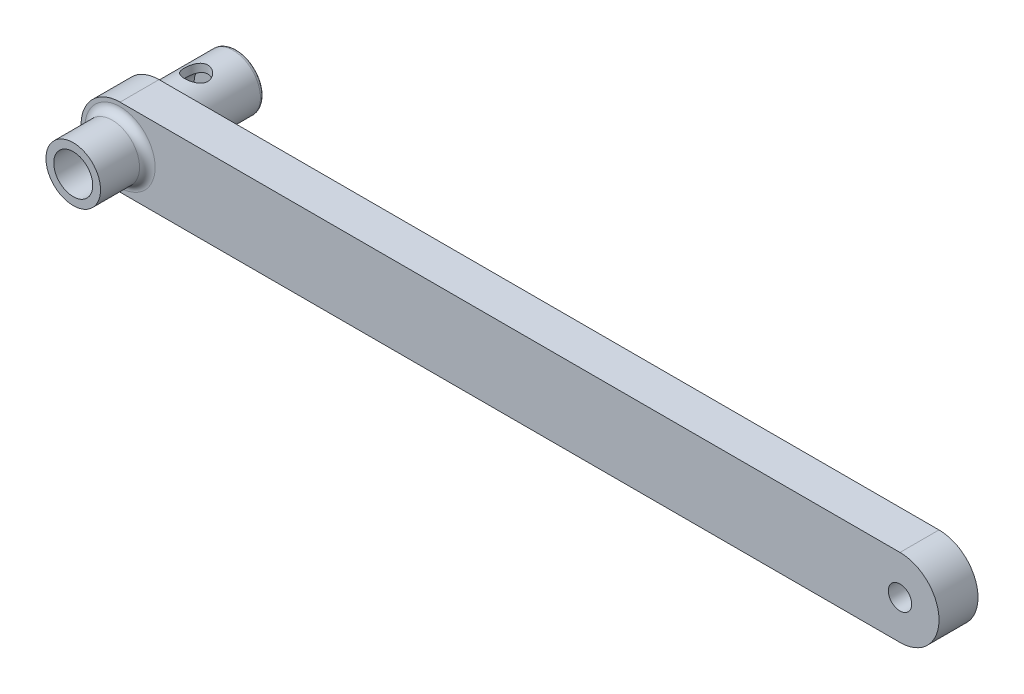
ISO-10303-21;
HEADER;
FILE_DESCRIPTION(('STEP AP214'),'2;1');
FILE_NAME('part.step','',(''),(''),'','','');
FILE_SCHEMA(('AUTOMOTIVE_DESIGN { 1 0 10303 214 1 1 1 1 }'));
ENDSEC;
DATA;
#1=APPLICATION_CONTEXT('core data for automotive mechanical design processes');
#2=APPLICATION_PROTOCOL_DEFINITION('international standard','automotive_design',2000,#1);
#3=PRODUCT_CONTEXT('',#1,'mechanical');
#4=PRODUCT('Part','Part','',(#3));
#5=PRODUCT_RELATED_PRODUCT_CATEGORY('part','',(#4));
#6=PRODUCT_DEFINITION_FORMATION('','',#4);
#7=PRODUCT_DEFINITION_CONTEXT('part definition',#1,'design');
#8=PRODUCT_DEFINITION('design','',#6,#7);
#9=PRODUCT_DEFINITION_SHAPE('','',#8);
#10=(LENGTH_UNIT() NAMED_UNIT(*) SI_UNIT(.MILLI.,.METRE.));
#11=(NAMED_UNIT(*) PLANE_ANGLE_UNIT() SI_UNIT($,.RADIAN.));
#12=(NAMED_UNIT(*) SI_UNIT($,.STERADIAN.) SOLID_ANGLE_UNIT());
#13=UNCERTAINTY_MEASURE_WITH_UNIT(LENGTH_MEASURE(1.E-05),#10,'distance_accuracy_value','');
#14=(GEOMETRIC_REPRESENTATION_CONTEXT(3) GLOBAL_UNCERTAINTY_ASSIGNED_CONTEXT((#13)) GLOBAL_UNIT_ASSIGNED_CONTEXT((#10,
#11,#12)) REPRESENTATION_CONTEXT('',''));
#15=CARTESIAN_POINT('',(0.,0.,0.));
#16=DIRECTION('',(0.,0.,1.));
#17=DIRECTION('',(1.,0.,0.));
#18=AXIS2_PLACEMENT_3D('',#15,#16,#17);
#19=CARTESIAN_POINT('',(-50.,0.,-0.999999999999999));
#20=DIRECTION('',(0.,0.,1.));
#21=DIRECTION('',(1.,0.,0.));
#22=AXIS2_PLACEMENT_3D('',#19,#20,#21);
#23=TOROIDAL_SURFACE('',#22,4.5,1.);
#24=CARTESIAN_POINT('',(-50.,0.,0.));
#25=DIRECTION('',(0.,0.,1.));
#26=DIRECTION('',(1.,0.,0.));
#27=AXIS2_PLACEMENT_3D('',#24,#25,#26);
#28=CIRCLE('',#27,4.5);
#29=CARTESIAN_POINT('',(-45.5,0.,0.));
#30=VERTEX_POINT('',#29);
#31=EDGE_CURVE('E41',#30,#30,#28,.T.);
#32=ORIENTED_EDGE('',*,*,#31,.F.);
#33=EDGE_LOOP('',(#32));
#34=FACE_BOUND('',#33,.T.);
#35=CARTESIAN_POINT('',(-50.,0.,-0.999999999999999));
#36=DIRECTION('',(0.,0.,1.));
#37=DIRECTION('',(1.,0.,0.));
#38=AXIS2_PLACEMENT_3D('',#35,#36,#37);
#39=CIRCLE('',#38,3.5);
#40=CARTESIAN_POINT('',(-46.5,0.,-0.999999999999999));
#41=VERTEX_POINT('',#40);
#42=EDGE_CURVE('E11',#41,#41,#39,.F.);
#43=ORIENTED_EDGE('',*,*,#42,.F.);
#44=EDGE_LOOP('',(#43));
#45=FACE_BOUND('',#44,.T.);
#46=ADVANCED_FACE('F33',(#34,#45),#23,.F.);
#47=CARTESIAN_POINT('',(-50.,0.,6.));
#48=DIRECTION('',(0.,0.,1.));
#49=DIRECTION('',(1.,0.,0.));
#50=AXIS2_PLACEMENT_3D('',#47,#48,#49);
#51=TOROIDAL_SURFACE('',#50,4.5,1.);
#52=CARTESIAN_POINT('',(-50.,0.,6.));
#53=DIRECTION('',(0.,0.,1.));
#54=DIRECTION('',(1.,0.,0.));
#55=AXIS2_PLACEMENT_3D('',#52,#53,#54);
#56=CIRCLE('',#55,3.5);
#57=CARTESIAN_POINT('',(-46.5,0.,6.));
#58=VERTEX_POINT('',#57);
#59=EDGE_CURVE('E116',#58,#58,#56,.T.);
#60=ORIENTED_EDGE('',*,*,#59,.F.);
#61=EDGE_LOOP('',(#60));
#62=FACE_BOUND('',#61,.T.);
#63=CARTESIAN_POINT('',(-50.,0.,5.));
#64=DIRECTION('',(0.,0.,1.));
#65=DIRECTION('',(1.,0.,0.));
#66=AXIS2_PLACEMENT_3D('',#63,#64,#65);
#67=CIRCLE('',#66,4.5);
#68=CARTESIAN_POINT('',(-45.5,0.,5.));
#69=VERTEX_POINT('',#68);
#70=EDGE_CURVE('E203',#69,#69,#67,.F.);
#71=ORIENTED_EDGE('',*,*,#70,.F.);
#72=EDGE_LOOP('',(#71));
#73=FACE_BOUND('',#72,.T.);
#74=ADVANCED_FACE('F174',(#62,#73),#51,.F.);
#75=CARTESIAN_POINT('',(-50.,0.,5.));
#76=DIRECTION('',(0.,0.,1.));
#77=DIRECTION('',(1.,0.,0.));
#78=AXIS2_PLACEMENT_3D('',#75,#76,#77);
#79=PLANE('',#78);
#80=ORIENTED_EDGE('',*,*,#70,.T.);
#81=EDGE_LOOP('',(#80));
#82=FACE_BOUND('',#81,.T.);
#83=CARTESIAN_POINT('',(50.,0.,5.));
#84=DIRECTION('',(0.,0.,1.));
#85=DIRECTION('',(1.,0.,0.));
#86=AXIS2_PLACEMENT_3D('',#83,#84,#85);
#87=CIRCLE('',#86,1.5);
#88=CARTESIAN_POINT('',(51.5,0.,5.));
#89=VERTEX_POINT('',#88);
#90=EDGE_CURVE('E103',#89,#89,#87,.T.);
#91=ORIENTED_EDGE('',*,*,#90,.F.);
#92=EDGE_LOOP('',(#91));
#93=FACE_BOUND('',#92,.T.);
#94=CARTESIAN_POINT('',(-50.,0.,5.));
#95=DIRECTION('',(0.,0.,1.));
#96=DIRECTION('',(1.,0.,0.));
#97=AXIS2_PLACEMENT_3D('',#94,#95,#96);
#98=CIRCLE('',#97,5.);
#99=CARTESIAN_POINT('',(-50.,5.,5.));
#100=VERTEX_POINT('',#99);
#101=CARTESIAN_POINT('',(-50.,-5.,5.));
#102=VERTEX_POINT('',#101);
#103=EDGE_CURVE('E85',#100,#102,#98,.T.);
#104=ORIENTED_EDGE('',*,*,#103,.T.);
#105=DIRECTION('',(1.,0.,0.));
#106=VECTOR('',#105,1.);
#107=CARTESIAN_POINT('',(-50.,-5.,5.));
#108=LINE('',#107,#106);
#109=CARTESIAN_POINT('',(50.,-4.99999999999998,5.));
#110=VERTEX_POINT('',#109);
#111=EDGE_CURVE('E80',#102,#110,#108,.T.);
#112=ORIENTED_EDGE('',*,*,#111,.T.);
#113=CARTESIAN_POINT('',(50.,0.,5.));
#114=DIRECTION('',(0.,0.,1.));
#115=DIRECTION('',(1.,0.,0.));
#116=AXIS2_PLACEMENT_3D('',#113,#114,#115);
#117=CIRCLE('',#116,5.);
#118=CARTESIAN_POINT('',(50.,5.00000000000002,5.));
#119=VERTEX_POINT('',#118);
#120=EDGE_CURVE('E83',#110,#119,#117,.T.);
#121=ORIENTED_EDGE('',*,*,#120,.T.);
#122=DIRECTION('',(-1.,0.,0.));
#123=VECTOR('',#122,1.);
#124=CARTESIAN_POINT('',(-50.,5.,5.));
#125=LINE('',#124,#123);
#126=EDGE_CURVE('E49',#119,#100,#125,.T.);
#127=ORIENTED_EDGE('',*,*,#126,.T.);
#128=EDGE_LOOP('',(#104,#112,#121,#127));
#129=FACE_BOUND('',#128,.T.);
#130=ADVANCED_FACE('F81',(#82,#93,#129),#79,.T.);
#131=CARTESIAN_POINT('',(-50.,0.,5.));
#132=DIRECTION('',(0.,0.,-1.));
#133=DIRECTION('',(-1.,0.,0.));
#134=AXIS2_PLACEMENT_3D('',#131,#132,#133);
#135=CYLINDRICAL_SURFACE('',#134,2.5);
#136=CARTESIAN_POINT('',(-50.,-2.5,-3.25));
#137=CARTESIAN_POINT('',(-49.923270166538,-2.49999625789733,-3.25000409100988));
#138=CARTESIAN_POINT('',(-49.8464176793558,-2.4964290461501,-3.25592867092626));
#139=CARTESIAN_POINT('',(-49.6950244904693,-2.48249903608568,-3.27932431951532));
#140=CARTESIAN_POINT('',(-49.620489965404,-2.47211948032719,-3.29682386185422));
#141=CARTESIAN_POINT('',(-49.4762481722092,-2.44561558054488,-3.34238636116685));
#142=CARTESIAN_POINT('',(-49.4065189717734,-2.42951973272944,-3.37039695816315));
#143=CARTESIAN_POINT('',(-49.2729696817853,-2.39295367626408,-3.43586033314102));
#144=CARTESIAN_POINT('',(-49.2091481305836,-2.37248455380255,-3.47331076696874));
#145=CARTESIAN_POINT('',(-49.0837007210007,-2.32705360719088,-3.55977482670858));
#146=CARTESIAN_POINT('',(-49.0226159799186,-2.30186792195985,-3.60945369535139));
#147=CARTESIAN_POINT('',(-48.9091172958811,-2.25030439279634,-3.71746720382827));
#148=CARTESIAN_POINT('',(-48.8567146505189,-2.22392505153571,-3.77581293718731));
#149=CARTESIAN_POINT('',(-48.7555500323703,-2.1691106699591,-3.90792351049673));
#150=CARTESIAN_POINT('',(-48.7080223362119,-2.14082017703649,-3.98270177098128));
#151=CARTESIAN_POINT('',(-48.626385622351,-2.08938301412124,-4.14084657324311));
#152=CARTESIAN_POINT('',(-48.5922548266484,-2.06622802273938,-4.22419889624757));
#153=CARTESIAN_POINT('',(-48.5455939828578,-2.0335462966093,-4.37659645065324));
#154=CARTESIAN_POINT('',(-48.5298380275317,-2.02207883137591,-4.44423599861032));
#155=CARTESIAN_POINT('',(-48.5078382765952,-2.00590308295503,-4.58180371583037));
#156=CARTESIAN_POINT('',(-48.5015826544316,-2.00118639643759,-4.6517289287545));
#157=CARTESIAN_POINT('',(-48.4989449120399,-1.99920922463856,-4.79201149421734));
#158=CARTESIAN_POINT('',(-48.5025821659158,-2.00196337012718,-4.8623694250932));
#159=CARTESIAN_POINT('',(-48.5195393952117,-2.01453261443741,-5.00127877542759));
#160=CARTESIAN_POINT('',(-48.532866653799,-2.02435302432226,-5.06982879584745));
#161=CARTESIAN_POINT('',(-48.5682607811821,-2.04953186944258,-5.20253024212811));
#162=CARTESIAN_POINT('',(-48.5902125133391,-2.06481711652537,-5.26672705392449));
#163=CARTESIAN_POINT('',(-48.6420493822916,-2.09927051350828,-5.39069499092813));
#164=CARTESIAN_POINT('',(-48.671937427403,-2.11844008623465,-5.45046448342393));
#165=CARTESIAN_POINT('',(-48.7448201681542,-2.16255327268985,-5.57498409712281));
#166=CARTESIAN_POINT('',(-48.7891927560228,-2.18792043372992,-5.63877809295493));
#167=CARTESIAN_POINT('',(-48.88708907216,-2.23930599764381,-5.75867648366702));
#168=CARTESIAN_POINT('',(-48.9406215489942,-2.26532500262149,-5.81477343397651));
#169=CARTESIAN_POINT('',(-49.064188165617,-2.31935504958317,-5.92561298182176));
#170=CARTESIAN_POINT('',(-49.135482317295,-2.34713836268533,-5.97907730601599));
#171=CARTESIAN_POINT('',(-49.287723949541,-2.39772428433981,-6.07312204719791));
#172=CARTESIAN_POINT('',(-49.3686662360564,-2.42052955425515,-6.11370935378996));
#173=CARTESIAN_POINT('',(-49.5328024147318,-2.45730392066151,-6.1779321827959));
#174=CARTESIAN_POINT('',(-49.6155323758264,-2.47173957439704,-6.20247535571592));
#175=CARTESIAN_POINT('',(-49.7849521048554,-2.49218842813551,-6.23701119740538));
#176=CARTESIAN_POINT('',(-49.8716369943387,-2.49821172952738,-6.24702131775358));
#177=CARTESIAN_POINT('',(-50.0337146143774,-2.5009057037461,-6.25150784767831));
#178=CARTESIAN_POINT('',(-50.1090424734187,-2.49873521714286,-6.24790885508518));
#179=CARTESIAN_POINT('',(-50.2578294019861,-2.48778712087049,-6.22957414692808));
#180=CARTESIAN_POINT('',(-50.3312885093761,-2.47900964518038,-6.21483865719419));
#181=CARTESIAN_POINT('',(-50.4725749321576,-2.45594792442191,-6.17545656718754));
#182=CARTESIAN_POINT('',(-50.5404957509285,-2.44180275662555,-6.15105965092654));
#183=CARTESIAN_POINT('',(-50.6712657490873,-2.40913880862845,-6.09332262363473));
#184=CARTESIAN_POINT('',(-50.7341139249639,-2.39061916586511,-6.05998074865333));
#185=CARTESIAN_POINT('',(-50.8600062628239,-2.3484549623736,-5.98144302079129));
#186=CARTESIAN_POINT('',(-50.9223941504569,-2.3244780273988,-5.93537617092161));
#187=CARTESIAN_POINT('',(-51.0390260313102,-2.27474265574732,-5.83460860651138));
#188=CARTESIAN_POINT('',(-51.0932604027374,-2.2489821658636,-5.77989784514746));
#189=CARTESIAN_POINT('',(-51.1993199673558,-2.19445423909891,-5.65508960996285));
#190=CARTESIAN_POINT('',(-51.2499101963092,-2.16573241746291,-5.5839161145345));
#191=CARTESIAN_POINT('',(-51.3384523891567,-2.1121618206671,-5.43278397543179));
#192=CARTESIAN_POINT('',(-51.3764176676978,-2.08730897997689,-5.35283470610721));
#193=CARTESIAN_POINT('',(-51.4314257879578,-2.04984909240519,-5.2037569776933));
#194=CARTESIAN_POINT('',(-51.4512162533619,-2.03575659328728,-5.13601968764141));
#195=CARTESIAN_POINT('',(-51.4811366390597,-2.01409605743544,-4.99746792191989));
#196=CARTESIAN_POINT('',(-51.4912799529763,-2.00651897642721,-4.92665785567216));
#197=CARTESIAN_POINT('',(-51.5013413041663,-1.99900446616268,-4.78362305240296));
#198=CARTESIAN_POINT('',(-51.5012208910787,-1.99909576445937,-4.71139400931295));
#199=CARTESIAN_POINT('',(-51.4906647295933,-2.0069771789285,-4.56810556439053));
#200=CARTESIAN_POINT('',(-51.4802233721576,-2.0147714813882,-4.4970468199194));
#201=CARTESIAN_POINT('',(-51.4504017414891,-2.0363318524298,-4.36151158242781));
#202=CARTESIAN_POINT('',(-51.4314763684535,-2.04979211805581,-4.29688290569312));
#203=CARTESIAN_POINT('',(-51.3856324207699,-2.08105501960152,-4.17166274552577));
#204=CARTESIAN_POINT('',(-51.3587108358848,-2.09885929040482,-4.11107279303944));
#205=CARTESIAN_POINT('',(-51.2928924555573,-2.14012990550917,-3.98568014277921));
#206=CARTESIAN_POINT('',(-51.2527916767575,-2.1640458758264,-3.92165889614569));
#207=CARTESIAN_POINT('',(-51.1637569838908,-2.21320127030768,-3.8006199273827));
#208=CARTESIAN_POINT('',(-51.114815796078,-2.23844177205022,-3.74360803784744));
#209=CARTESIAN_POINT('',(-51.0000977742573,-2.29225690291477,-3.62864905086832));
#210=CARTESIAN_POINT('',(-50.9328768193139,-2.32070308663658,-3.5720689251038));
#211=CARTESIAN_POINT('',(-50.7884624344456,-2.37365428872368,-3.47090214413669));
#212=CARTESIAN_POINT('',(-50.7112654445015,-2.39815789310936,-3.4263197880152));
#213=CARTESIAN_POINT('',(-50.5511252308014,-2.43985578654394,-3.35221419242626));
#214=CARTESIAN_POINT('',(-50.4684300869572,-2.45725077479787,-3.32227193507317));
#215=CARTESIAN_POINT('',(-50.2979733061188,-2.48366273001246,-3.27727530478902));
#216=CARTESIAN_POINT('',(-50.2102320996486,-2.49271125871485,-3.26216483214301));
#217=CARTESIAN_POINT('',(-50.1015580969175,-2.49802001168187,-3.25330254529134));
#218=CARTESIAN_POINT('',(-50.0812762590283,-2.49876114656362,-3.2520655826939));
#219=CARTESIAN_POINT('',(-50.0406658206871,-2.49975164517367,-3.25041375362913));
#220=CARTESIAN_POINT('',(-50.0203372186376,-2.50000099184316,-3.24999891567909));
#221=CARTESIAN_POINT('',(-50.,-2.5,-3.25));
#222=B_SPLINE_CURVE_WITH_KNOTS('',3,(#136,#137,#138,#139,#140,#141,#142,#143,#144,#145,#146,
#147,#148,#149,#150,#151,#152,#153,#154,#155,#156,#157,#158,#159,#160,#161,#162,#163,#164,#165,
#166,#167,#168,#169,#170,#171,#172,#173,#174,#175,#176,#177,#178,#179,#180,#181,#182,#183,#184,
#185,#186,#187,#188,#189,#190,#191,#192,#193,#194,#195,#196,#197,#198,#199,#200,#201,#202,#203,
#204,#205,#206,#207,#208,#209,#210,#211,#212,#213,#214,#215,#216,#217,#218,#219,#220,#221),
.UNSPECIFIED.,.T.,.F.,(4,2,2,2,2,2,2,2,2,2,2,2,2,2,2,2,2,2,2,2,2,2,2,2,2,2,2,2,2,2,2,2,2,2,2,2,
2,2,2,2,2,2,4),(0.,0.230102237548654,0.460772627520013,0.690308884600009,0.919788197992274,
1.16681590732472,1.414162579348,1.69183813189807,1.96906040692092,2.17933829855634,
2.38935420916579,2.59978170870727,2.81036753273873,3.01823267593208,3.22617409809869,
3.47046995225164,3.71500044803675,3.99360957884692,4.27206939275325,4.53296790696561,
4.79355286918237,5.01875602722427,5.24395461863457,5.46367785689773,5.68344445659027,
5.92601365818364,6.16886690081838,6.44336762428012,6.71757792616458,6.93257787314695,
7.14727888733321,7.36278425777436,7.57840681155727,7.78364098331145,7.98895251523038,
8.22578610052289,8.46281544370211,8.73854311775522,9.01436946031988,9.28175654462679,
9.54812832184451,9.60911473335179,9.67010326027643),.UNSPECIFIED.);
#223=CARTESIAN_POINT('',(-50.,-2.5,-3.25));
#224=VERTEX_POINT('',#223);
#225=EDGE_CURVE('E158',#224,#224,#222,.T.);
#226=ORIENTED_EDGE('',*,*,#225,.F.);
#227=EDGE_LOOP('',(#226));
#228=FACE_BOUND('',#227,.T.);
#229=CARTESIAN_POINT('',(-50.,2.5,-3.25));
#230=CARTESIAN_POINT('',(-50.076729833462,2.49999625789733,-3.25000409100988));
#231=CARTESIAN_POINT('',(-50.1535823206442,2.4964290461501,-3.25592867092626));
#232=CARTESIAN_POINT('',(-50.3049755095307,2.48249903608568,-3.27932431951532));
#233=CARTESIAN_POINT('',(-50.3795100345961,2.47211948032719,-3.29682386185422));
#234=CARTESIAN_POINT('',(-50.5237518277908,2.44561558054488,-3.34238636116685));
#235=CARTESIAN_POINT('',(-50.5934810282266,2.42951973272944,-3.37039695816315));
#236=CARTESIAN_POINT('',(-50.7270303182147,2.39295367626408,-3.43586033314102));
#237=CARTESIAN_POINT('',(-50.7908518694164,2.37248455380255,-3.47331076696874));
#238=CARTESIAN_POINT('',(-50.9162992789993,2.32705360719088,-3.55977482670858));
#239=CARTESIAN_POINT('',(-50.9773840200814,2.30186792195985,-3.60945369535139));
#240=CARTESIAN_POINT('',(-51.0908827041189,2.25030439279634,-3.71746720382827));
#241=CARTESIAN_POINT('',(-51.1432853494811,2.22392505153571,-3.77581293718731));
#242=CARTESIAN_POINT('',(-51.2444499676297,2.1691106699591,-3.90792351049673));
#243=CARTESIAN_POINT('',(-51.2919776637881,2.14082017703649,-3.98270177098128));
#244=CARTESIAN_POINT('',(-51.373614377649,2.08938301412124,-4.14084657324311));
#245=CARTESIAN_POINT('',(-51.4077451733516,2.06622802273938,-4.22419889624757));
#246=CARTESIAN_POINT('',(-51.4544060171422,2.0335462966093,-4.37659645065324));
#247=CARTESIAN_POINT('',(-51.4701619724683,2.02207883137591,-4.44423599861032));
#248=CARTESIAN_POINT('',(-51.4921617234048,2.00590308295503,-4.58180371583037));
#249=CARTESIAN_POINT('',(-51.4984173455684,2.00118639643759,-4.6517289287545));
#250=CARTESIAN_POINT('',(-51.5010550879601,1.99920922463856,-4.79201149421734));
#251=CARTESIAN_POINT('',(-51.4974178340842,2.00196337012718,-4.8623694250932));
#252=CARTESIAN_POINT('',(-51.4804606047883,2.01453261443741,-5.00127877542759));
#253=CARTESIAN_POINT('',(-51.467133346201,2.02435302432226,-5.06982879584745));
#254=CARTESIAN_POINT('',(-51.4317392188179,2.04953186944258,-5.20253024212811));
#255=CARTESIAN_POINT('',(-51.4097874866609,2.06481711652537,-5.26672705392449));
#256=CARTESIAN_POINT('',(-51.3579506177084,2.09927051350828,-5.39069499092813));
#257=CARTESIAN_POINT('',(-51.3280625725971,2.11844008623465,-5.45046448342393));
#258=CARTESIAN_POINT('',(-51.2551798318458,2.16255327268985,-5.57498409712281));
#259=CARTESIAN_POINT('',(-51.2108072439772,2.18792043372992,-5.63877809295493));
#260=CARTESIAN_POINT('',(-51.11291092784,2.23930599764381,-5.75867648366702));
#261=CARTESIAN_POINT('',(-51.0593784510058,2.26532500262149,-5.81477343397651));
#262=CARTESIAN_POINT('',(-50.935811834383,2.31935504958317,-5.92561298182176));
#263=CARTESIAN_POINT('',(-50.864517682705,2.34713836268533,-5.979077306016));
#264=CARTESIAN_POINT('',(-50.712276050459,2.39772428433981,-6.07312204719792));
#265=CARTESIAN_POINT('',(-50.6313337639436,2.42052955425515,-6.11370935378996));
#266=CARTESIAN_POINT('',(-50.4671975852682,2.45730392066151,-6.1779321827959));
#267=CARTESIAN_POINT('',(-50.3844676241736,2.47173957439704,-6.20247535571592));
#268=CARTESIAN_POINT('',(-50.2150478951446,2.49218842813551,-6.23701119740538));
#269=CARTESIAN_POINT('',(-50.1283630056613,2.49821172952738,-6.24702131775358));
#270=CARTESIAN_POINT('',(-49.9662853856226,2.5009057037461,-6.25150784767831));
#271=CARTESIAN_POINT('',(-49.8909575265813,2.49873521714286,-6.24790885508518));
#272=CARTESIAN_POINT('',(-49.7421705980139,2.48778712087049,-6.22957414692808));
#273=CARTESIAN_POINT('',(-49.6687114906239,2.47900964518038,-6.21483865719419));
#274=CARTESIAN_POINT('',(-49.5274250678424,2.45594792442191,-6.17545656718754));
#275=CARTESIAN_POINT('',(-49.4595042490715,2.44180275662555,-6.15105965092654));
#276=CARTESIAN_POINT('',(-49.3287342509127,2.40913880862845,-6.09332262363473));
#277=CARTESIAN_POINT('',(-49.2658860750361,2.39061916586511,-6.05998074865333));
#278=CARTESIAN_POINT('',(-49.1399937371761,2.3484549623736,-5.98144302079129));
#279=CARTESIAN_POINT('',(-49.0776058495432,2.3244780273988,-5.93537617092161));
#280=CARTESIAN_POINT('',(-48.9609739686899,2.27474265574732,-5.83460860651138));
#281=CARTESIAN_POINT('',(-48.9067395972626,2.2489821658636,-5.77989784514746));
#282=CARTESIAN_POINT('',(-48.8006800326442,2.19445423909891,-5.65508960996285));
#283=CARTESIAN_POINT('',(-48.7500898036908,2.16573241746291,-5.5839161145345));
#284=CARTESIAN_POINT('',(-48.6615476108433,2.1121618206671,-5.43278397543179));
#285=CARTESIAN_POINT('',(-48.6235823323022,2.08730897997689,-5.35283470610721));
#286=CARTESIAN_POINT('',(-48.5685742120422,2.04984909240519,-5.2037569776933));
#287=CARTESIAN_POINT('',(-48.5487837466381,2.03575659328728,-5.13601968764141));
#288=CARTESIAN_POINT('',(-48.5188633609403,2.01409605743544,-4.99746792191989));
#289=CARTESIAN_POINT('',(-48.5087200470237,2.00651897642721,-4.92665785567216));
#290=CARTESIAN_POINT('',(-48.4986586958337,1.99900446616268,-4.78362305240296));
#291=CARTESIAN_POINT('',(-48.4987791089213,1.99909576445937,-4.71139400931295));
#292=CARTESIAN_POINT('',(-48.5093352704067,2.0069771789285,-4.56810556439053));
#293=CARTESIAN_POINT('',(-48.5197766278424,2.0147714813882,-4.4970468199194));
#294=CARTESIAN_POINT('',(-48.5495982585109,2.0363318524298,-4.36151158242781));
#295=CARTESIAN_POINT('',(-48.5685236315465,2.04979211805581,-4.29688290569312));
#296=CARTESIAN_POINT('',(-48.6143675792301,2.08105501960152,-4.17166274552577));
#297=CARTESIAN_POINT('',(-48.6412891641152,2.09885929040482,-4.11107279303944));
#298=CARTESIAN_POINT('',(-48.7071075444427,2.14012990550917,-3.98568014277921));
#299=CARTESIAN_POINT('',(-48.7472083232425,2.1640458758264,-3.92165889614569));
#300=CARTESIAN_POINT('',(-48.8362430161092,2.21320127030768,-3.8006199273827));
#301=CARTESIAN_POINT('',(-48.885184203922,2.23844177205022,-3.74360803784744));
#302=CARTESIAN_POINT('',(-48.9999022257427,2.29225690291477,-3.62864905086832));
#303=CARTESIAN_POINT('',(-49.0671231806861,2.32070308663658,-3.57206892510381));
#304=CARTESIAN_POINT('',(-49.2115375655544,2.37365428872368,-3.47090214413669));
#305=CARTESIAN_POINT('',(-49.2887345554985,2.39815789310936,-3.4263197880152));
#306=CARTESIAN_POINT('',(-49.4488747691986,2.43985578654394,-3.35221419242626));
#307=CARTESIAN_POINT('',(-49.5315699130428,2.45725077479787,-3.32227193507317));
#308=CARTESIAN_POINT('',(-49.7020266938812,2.48366273001246,-3.27727530478902));
#309=CARTESIAN_POINT('',(-49.7897679003514,2.49271125871485,-3.26216483214301));
#310=CARTESIAN_POINT('',(-49.8984419030825,2.49802001168187,-3.25330254529134));
#311=CARTESIAN_POINT('',(-49.9187237409717,2.49876114656362,-3.2520655826939));
#312=CARTESIAN_POINT('',(-49.9593341793129,2.49975164517367,-3.25041375362913));
#313=CARTESIAN_POINT('',(-49.9796627813624,2.50000099184316,-3.24999891567909));
#314=CARTESIAN_POINT('',(-50.,2.5,-3.25));
#315=B_SPLINE_CURVE_WITH_KNOTS('',3,(#229,#230,#231,#232,#233,#234,#235,#236,#237,#238,#239,
#240,#241,#242,#243,#244,#245,#246,#247,#248,#249,#250,#251,#252,#253,#254,#255,#256,#257,#258,
#259,#260,#261,#262,#263,#264,#265,#266,#267,#268,#269,#270,#271,#272,#273,#274,#275,#276,#277,
#278,#279,#280,#281,#282,#283,#284,#285,#286,#287,#288,#289,#290,#291,#292,#293,#294,#295,#296,
#297,#298,#299,#300,#301,#302,#303,#304,#305,#306,#307,#308,#309,#310,#311,#312,#313,#314),
.UNSPECIFIED.,.T.,.F.,(4,2,2,2,2,2,2,2,2,2,2,2,2,2,2,2,2,2,2,2,2,2,2,2,2,2,2,2,2,2,2,2,2,2,2,2,
2,2,2,2,2,2,4),(0.,0.230102237548654,0.460772627520013,0.690308884600009,0.919788197992274,
1.16681590732472,1.414162579348,1.69183813189807,1.96906040692092,2.17933829855634,
2.38935420916579,2.59978170870727,2.81036753273873,3.01823267593208,3.22617409809869,
3.47046995225164,3.71500044803675,3.99360957884693,4.27206939275325,4.53296790696561,
4.79355286918237,5.01875602722427,5.24395461863457,5.46367785689773,5.68344445659027,
5.92601365818364,6.16886690081838,6.44336762428012,6.71757792616458,6.93257787314695,
7.14727888733321,7.36278425777436,7.57840681155727,7.78364098331145,7.98895251523038,
8.22578610052289,8.46281544370211,8.73854311775521,9.01436946031988,9.28175654462679,
9.54812832184451,9.6091147333518,9.67010326027643),.UNSPECIFIED.);
#316=CARTESIAN_POINT('',(-50.,2.5,-3.25));
#317=VERTEX_POINT('',#316);
#318=EDGE_CURVE('E151',#317,#317,#315,.T.);
#319=ORIENTED_EDGE('',*,*,#318,.F.);
#320=EDGE_LOOP('',(#319));
#321=FACE_BOUND('',#320,.T.);
#322=CARTESIAN_POINT('',(-50.,0.,-7.));
#323=DIRECTION('',(0.,0.,-1.));
#324=DIRECTION('',(-1.,0.,0.));
#325=AXIS2_PLACEMENT_3D('',#322,#323,#324);
#326=CIRCLE('',#325,2.5);
#327=CARTESIAN_POINT('',(-52.5,0.,-7.));
#328=VERTEX_POINT('',#327);
#329=EDGE_CURVE('E257',#328,#328,#326,.T.);
#330=ORIENTED_EDGE('',*,*,#329,.T.);
#331=EDGE_LOOP('',(#330));
#332=FACE_BOUND('',#331,.T.);
#333=CARTESIAN_POINT('',(-50.,0.,11.));
#334=DIRECTION('',(0.,0.,1.));
#335=DIRECTION('',(1.,0.,0.));
#336=AXIS2_PLACEMENT_3D('',#333,#334,#335);
#337=CIRCLE('',#336,2.5);
#338=CARTESIAN_POINT('',(-47.5,0.,11.));
#339=VERTEX_POINT('',#338);
#340=EDGE_CURVE('E213',#339,#339,#337,.T.);
#341=ORIENTED_EDGE('',*,*,#340,.T.);
#342=EDGE_LOOP('',(#341));
#343=FACE_BOUND('',#342,.T.);
#344=ADVANCED_FACE('F164',(#228,#321,#332,#343),#135,.F.);
#345=CARTESIAN_POINT('',(-50.,0.,0.));
#346=DIRECTION('',(0.,0.,1.));
#347=DIRECTION('',(1.,0.,0.));
#348=AXIS2_PLACEMENT_3D('',#345,#346,#347);
#349=PLANE('',#348);
#350=ORIENTED_EDGE('',*,*,#31,.T.);
#351=EDGE_LOOP('',(#350));
#352=FACE_BOUND('',#351,.T.);
#353=CARTESIAN_POINT('',(-50.,0.,0.));
#354=DIRECTION('',(0.,0.,1.));
#355=DIRECTION('',(1.,0.,0.));
#356=AXIS2_PLACEMENT_3D('',#353,#354,#355);
#357=CIRCLE('',#356,5.);
#358=CARTESIAN_POINT('',(-50.,5.,0.));
#359=VERTEX_POINT('',#358);
#360=CARTESIAN_POINT('',(-50.,-5.,0.));
#361=VERTEX_POINT('',#360);
#362=EDGE_CURVE('E100',#359,#361,#357,.T.);
#363=ORIENTED_EDGE('',*,*,#362,.F.);
#364=DIRECTION('',(-1.,0.,0.));
#365=VECTOR('',#364,1.);
#366=CARTESIAN_POINT('',(-50.,5.,0.));
#367=LINE('',#366,#365);
#368=CARTESIAN_POINT('',(50.,5.00000000000002,0.));
#369=VERTEX_POINT('',#368);
#370=EDGE_CURVE('E72',#369,#359,#367,.T.);
#371=ORIENTED_EDGE('',*,*,#370,.F.);
#372=CARTESIAN_POINT('',(50.,0.,0.));
#373=DIRECTION('',(0.,0.,1.));
#374=DIRECTION('',(1.,0.,0.));
#375=AXIS2_PLACEMENT_3D('',#372,#373,#374);
#376=CIRCLE('',#375,5.);
#377=CARTESIAN_POINT('',(50.,-4.99999999999998,0.));
#378=VERTEX_POINT('',#377);
#379=EDGE_CURVE('E66',#378,#369,#376,.T.);
#380=ORIENTED_EDGE('',*,*,#379,.F.);
#381=DIRECTION('',(1.,0.,0.));
#382=VECTOR('',#381,1.);
#383=CARTESIAN_POINT('',(-50.,-5.,0.));
#384=LINE('',#383,#382);
#385=EDGE_CURVE('E90',#361,#378,#384,.T.);
#386=ORIENTED_EDGE('',*,*,#385,.F.);
#387=EDGE_LOOP('',(#363,#371,#380,#386));
#388=FACE_BOUND('',#387,.T.);
#389=CARTESIAN_POINT('',(50.,0.,0.));
#390=DIRECTION('',(0.,0.,1.));
#391=DIRECTION('',(1.,0.,0.));
#392=AXIS2_PLACEMENT_3D('',#389,#390,#391);
#393=CIRCLE('',#392,1.5);
#394=CARTESIAN_POINT('',(51.5,0.,0.));
#395=VERTEX_POINT('',#394);
#396=EDGE_CURVE('E255',#395,#395,#393,.T.);
#397=ORIENTED_EDGE('',*,*,#396,.T.);
#398=EDGE_LOOP('',(#397));
#399=FACE_BOUND('',#398,.T.);
#400=ADVANCED_FACE('F168',(#352,#388,#399),#349,.F.);
#401=CARTESIAN_POINT('',(-50.,0.,5.));
#402=DIRECTION('',(0.,0.,-1.));
#403=DIRECTION('',(-1.,0.,0.));
#404=AXIS2_PLACEMENT_3D('',#401,#402,#403);
#405=CYLINDRICAL_SURFACE('',#404,5.);
#406=ORIENTED_EDGE('',*,*,#362,.T.);
#407=DIRECTION('',(0.,0.,-1.));
#408=VECTOR('',#407,1.);
#409=CARTESIAN_POINT('',(-50.,-5.,5.));
#410=LINE('',#409,#408);
#411=EDGE_CURVE('E91',#102,#361,#410,.T.);
#412=ORIENTED_EDGE('',*,*,#411,.F.);
#413=ORIENTED_EDGE('',*,*,#103,.F.);
#414=DIRECTION('',(0.,0.,-1.));
#415=VECTOR('',#414,1.);
#416=CARTESIAN_POINT('',(-50.,5.,5.));
#417=LINE('',#416,#415);
#418=EDGE_CURVE('E96',#100,#359,#417,.T.);
#419=ORIENTED_EDGE('',*,*,#418,.T.);
#420=EDGE_LOOP('',(#406,#412,#413,#419));
#421=FACE_BOUND('',#420,.T.);
#422=ADVANCED_FACE('F178',(#421),#405,.T.);
#423=CARTESIAN_POINT('',(-50.,-5.,5.));
#424=DIRECTION('',(0.,1.,0.));
#425=DIRECTION('',(-1.,0.,0.));
#426=AXIS2_PLACEMENT_3D('',#423,#424,#425);
#427=PLANE('',#426);
#428=ORIENTED_EDGE('',*,*,#385,.T.);
#429=DIRECTION('',(0.,0.,-1.));
#430=VECTOR('',#429,1.);
#431=CARTESIAN_POINT('',(50.,-4.99999999999998,5.));
#432=LINE('',#431,#430);
#433=EDGE_CURVE('E88',#110,#378,#432,.T.);
#434=ORIENTED_EDGE('',*,*,#433,.F.);
#435=ORIENTED_EDGE('',*,*,#111,.F.);
#436=ORIENTED_EDGE('',*,*,#411,.T.);
#437=EDGE_LOOP('',(#428,#434,#435,#436));
#438=FACE_BOUND('',#437,.T.);
#439=ADVANCED_FACE('F89',(#438),#427,.F.);
#440=CARTESIAN_POINT('',(50.,0.,5.));
#441=DIRECTION('',(0.,0.,-1.));
#442=DIRECTION('',(-1.,0.,0.));
#443=AXIS2_PLACEMENT_3D('',#440,#441,#442);
#444=CYLINDRICAL_SURFACE('',#443,5.);
#445=ORIENTED_EDGE('',*,*,#379,.T.);
#446=DIRECTION('',(0.,0.,-1.));
#447=VECTOR('',#446,1.);
#448=CARTESIAN_POINT('',(50.,5.00000000000002,5.));
#449=LINE('',#448,#447);
#450=EDGE_CURVE('E92',#119,#369,#449,.T.);
#451=ORIENTED_EDGE('',*,*,#450,.F.);
#452=ORIENTED_EDGE('',*,*,#120,.F.);
#453=ORIENTED_EDGE('',*,*,#433,.T.);
#454=EDGE_LOOP('',(#445,#451,#452,#453));
#455=FACE_BOUND('',#454,.T.);
#456=ADVANCED_FACE('F94',(#455),#444,.T.);
#457=CARTESIAN_POINT('',(-50.,5.,5.));
#458=DIRECTION('',(0.,-1.,0.));
#459=DIRECTION('',(1.,0.,0.));
#460=AXIS2_PLACEMENT_3D('',#457,#458,#459);
#461=PLANE('',#460);
#462=ORIENTED_EDGE('',*,*,#370,.T.);
#463=ORIENTED_EDGE('',*,*,#418,.F.);
#464=ORIENTED_EDGE('',*,*,#126,.F.);
#465=ORIENTED_EDGE('',*,*,#450,.T.);
#466=EDGE_LOOP('',(#462,#463,#464,#465));
#467=FACE_BOUND('',#466,.T.);
#468=ADVANCED_FACE('F180',(#467),#461,.F.);
#469=CARTESIAN_POINT('',(50.,0.,5.));
#470=DIRECTION('',(0.,0.,-1.));
#471=DIRECTION('',(-1.,0.,0.));
#472=AXIS2_PLACEMENT_3D('',#469,#470,#471);
#473=CYLINDRICAL_SURFACE('',#472,1.5);
#474=ORIENTED_EDGE('',*,*,#90,.T.);
#475=EDGE_LOOP('',(#474));
#476=FACE_BOUND('',#475,.T.);
#477=ORIENTED_EDGE('',*,*,#396,.F.);
#478=EDGE_LOOP('',(#477));
#479=FACE_BOUND('',#478,.T.);
#480=ADVANCED_FACE('F170',(#476,#479),#473,.F.);
#481=CARTESIAN_POINT('',(-50.,0.,-10.));
#482=DIRECTION('',(0.,0.,1.));
#483=DIRECTION('',(1.,0.,0.));
#484=AXIS2_PLACEMENT_3D('',#481,#482,#483);
#485=CYLINDRICAL_SURFACE('',#484,3.5);
#486=ORIENTED_EDGE('',*,*,#42,.T.);
#487=EDGE_LOOP('',(#486));
#488=FACE_BOUND('',#487,.T.);
#489=CARTESIAN_POINT('',(-50.,-3.5,-3.25));
#490=CARTESIAN_POINT('',(-50.0801521976824,-3.49999299268885,-3.25000922143898));
#491=CARTESIAN_POINT('',(-50.1604199921982,-3.4972151640971,-3.2564621297556));
#492=CARTESIAN_POINT('',(-50.3186716113612,-3.48637069204865,-3.28203970728538));
#493=CARTESIAN_POINT('',(-50.3966491490906,-3.47829069608751,-3.30119636978955));
#494=CARTESIAN_POINT('',(-50.5477681647464,-3.45770786336707,-3.35133527519898));
#495=CARTESIAN_POINT('',(-50.6209253861467,-3.44522036823866,-3.38227652746265));
#496=CARTESIAN_POINT('',(-50.7609364460719,-3.41702837926819,-3.45493210375048));
#497=CARTESIAN_POINT('',(-50.8277919856114,-3.40132475720839,-3.49664350915098));
#498=CARTESIAN_POINT('',(-50.9569207835461,-3.36733908702934,-3.59196385412534));
#499=CARTESIAN_POINT('',(-51.0188202442525,-3.34896947381213,-3.64604763807764));
#500=CARTESIAN_POINT('',(-51.1329951843693,-3.3120882776969,-3.76357192611615));
#501=CARTESIAN_POINT('',(-51.1852653205567,-3.29357662187921,-3.82701759007029));
#502=CARTESIAN_POINT('',(-51.2814284354819,-3.25741027462363,-3.96551636370652));
#503=CARTESIAN_POINT('',(-51.3247340600602,-3.23985230076501,-4.04100522964247));
#504=CARTESIAN_POINT('',(-51.3978659957443,-3.20898084363449,-4.19905471346701));
#505=CARTESIAN_POINT('',(-51.4276996453737,-3.19566505070703,-4.28161145208013));
#506=CARTESIAN_POINT('',(-51.4714745999144,-3.17573899533535,-4.44715036930945));
#507=CARTESIAN_POINT('',(-51.486137472097,-3.16882610719817,-4.52990385092736));
#508=CARTESIAN_POINT('',(-51.501403035704,-3.16162424842019,-4.69696298476757));
#509=CARTESIAN_POINT('',(-51.5020141430456,-3.16133131294301,-4.78126767764994));
#510=CARTESIAN_POINT('',(-51.489699997581,-3.16714786968021,-4.94164995184879));
#511=CARTESIAN_POINT('',(-51.4778805691083,-3.17273435527608,-5.01783531160627));
#512=CARTESIAN_POINT('',(-51.4429038640653,-3.18879205821456,-5.16701379288904));
#513=CARTESIAN_POINT('',(-51.4197442641722,-3.19926427650311,-5.24000625692878));
#514=CARTESIAN_POINT('',(-51.3622882953466,-3.22415342810443,-5.38262357573778));
#515=CARTESIAN_POINT('',(-51.3277598721403,-3.23865147551049,-5.4521401471145));
#516=CARTESIAN_POINT('',(-51.2487115243669,-3.26994246945713,-5.5846731620293));
#517=CARTESIAN_POINT('',(-51.204187537403,-3.28673634798109,-5.64768694746324));
#518=CARTESIAN_POINT('',(-51.1017170269606,-3.32256202266195,-5.77138875181234));
#519=CARTESIAN_POINT('',(-51.0429236442805,-3.34165927694226,-5.83135836473644));
#520=CARTESIAN_POINT('',(-50.9159366620255,-3.3786730287964,-5.94083579532754));
#521=CARTESIAN_POINT('',(-50.84774060814,-3.39658921627429,-5.99034087293899));
#522=CARTESIAN_POINT('',(-50.7015929115063,-3.4297984684468,-6.07862196640361));
#523=CARTESIAN_POINT('',(-50.6234355748512,-3.44501227516835,-6.11708950935283));
#524=CARTESIAN_POINT('',(-50.4609398470795,-3.47048698130307,-6.18007511880733));
#525=CARTESIAN_POINT('',(-50.3766051078288,-3.48075078019998,-6.20460135298885));
#526=CARTESIAN_POINT('',(-50.2101381194707,-3.49461763446686,-6.2374669302295));
#527=CARTESIAN_POINT('',(-50.1282289805055,-3.49861624982293,-6.2467693826572));
#528=CARTESIAN_POINT('',(-49.9639283494407,-3.50077708325871,-6.25181478820412));
#529=CARTESIAN_POINT('',(-49.8815370140497,-3.49894110265833,-6.2475619262662));
#530=CARTESIAN_POINT('',(-49.7232287801867,-3.48989338160075,-6.22629218397259));
#531=CARTESIAN_POINT('',(-49.647200534248,-3.48297259736823,-6.2099658392758));
#532=CARTESIAN_POINT('',(-49.4990544318037,-3.46476944004986,-6.16598955288096));
#533=CARTESIAN_POINT('',(-49.4269370631496,-3.45348652424256,-6.13833820213907));
#534=CARTESIAN_POINT('',(-49.286111517381,-3.42719375756864,-6.07159942024878));
#535=CARTESIAN_POINT('',(-49.2175801252425,-3.41207852694255,-6.03218183488638));
#536=CARTESIAN_POINT('',(-49.0878575471748,-3.37971494195701,-5.94339052776262));
#537=CARTESIAN_POINT('',(-49.0266695124289,-3.36246567824312,-5.89401255599057));
#538=CARTESIAN_POINT('',(-48.9085162023437,-3.32607394349023,-5.78235520607617));
#539=CARTESIAN_POINT('',(-48.8522169122572,-3.30688677499572,-5.71938389496011));
#540=CARTESIAN_POINT('',(-48.750782842756,-3.26992018844849,-5.58460885069339));
#541=CARTESIAN_POINT('',(-48.7056511677981,-3.25214116277359,-5.51280266984699));
#542=CARTESIAN_POINT('',(-48.6271806219362,-3.21981484643715,-5.36059307348568));
#543=CARTESIAN_POINT('',(-48.5940679252665,-3.20533127997694,-5.28005849534316));
#544=CARTESIAN_POINT('',(-48.5421705744911,-3.18206803761103,-5.11373683676197));
#545=CARTESIAN_POINT('',(-48.5233731775002,-3.17328328988834,-5.02795450132941));
#546=CARTESIAN_POINT('',(-48.501940259161,-3.16321740581935,-4.86100441338137));
#547=CARTESIAN_POINT('',(-48.4981265383376,-3.1613896288168,-4.78002036462019));
#548=CARTESIAN_POINT('',(-48.5035867491421,-3.16397809086751,-4.61860512816848));
#549=CARTESIAN_POINT('',(-48.5128583725131,-3.16839322866983,-4.5381738454847));
#550=CARTESIAN_POINT('',(-48.5432178590056,-3.1824582711803,-4.38447914613377));
#551=CARTESIAN_POINT('',(-48.5636651798662,-3.19182357178317,-4.31106058335268));
#552=CARTESIAN_POINT('',(-48.6151488299956,-3.21449437287189,-4.16868963782593));
#553=CARTESIAN_POINT('',(-48.6461881699376,-3.22780099349553,-4.09973853154671));
#554=CARTESIAN_POINT('',(-48.7201839777298,-3.25787626150961,-3.9635895630917));
#555=CARTESIAN_POINT('',(-48.7637597228723,-3.27480834339631,-3.89676510617978));
#556=CARTESIAN_POINT('',(-48.8607511111869,-3.3097987990854,-3.77100913646911));
#557=CARTESIAN_POINT('',(-48.9141704746571,-3.32785759700647,-3.71208062245602));
#558=CARTESIAN_POINT('',(-49.0343283244583,-3.36477750877144,-3.59899690268563));
#559=CARTESIAN_POINT('',(-49.1017851820187,-3.38358948911939,-3.54558526613147));
#560=CARTESIAN_POINT('',(-49.2453873862931,-3.41848089249468,-3.45078507330685));
#561=CARTESIAN_POINT('',(-49.3215366506173,-3.43455907522587,-3.40940196825022));
#562=CARTESIAN_POINT('',(-49.4793731971034,-3.46197513636854,-3.34065543042932));
#563=CARTESIAN_POINT('',(-49.5609635971418,-3.47337868320289,-3.31309647002069));
#564=CARTESIAN_POINT('',(-49.7280743425957,-3.49042295491409,-3.27236528523279));
#565=CARTESIAN_POINT('',(-49.8135816472887,-3.49608152963086,-3.25914849035336));
#566=CARTESIAN_POINT('',(-49.9329732393868,-3.49952115812385,-3.25111948904597));
#567=CARTESIAN_POINT('',(-49.9664765089393,-3.50000293079341,-3.2499961431522));
#568=CARTESIAN_POINT('',(-50.,-3.5,-3.25));
#569=B_SPLINE_CURVE_WITH_KNOTS('',3,(#489,#490,#491,#492,#493,#494,#495,#496,#497,#498,#499,
#500,#501,#502,#503,#504,#505,#506,#507,#508,#509,#510,#511,#512,#513,#514,#515,#516,#517,#518,
#519,#520,#521,#522,#523,#524,#525,#526,#527,#528,#529,#530,#531,#532,#533,#534,#535,#536,#537,
#538,#539,#540,#541,#542,#543,#544,#545,#546,#547,#548,#549,#550,#551,#552,#553,#554,#555,#556,
#557,#558,#559,#560,#561,#562,#563,#564,#565,#566,#567,#568),.UNSPECIFIED.,.T.,.F.,(4,2,2,2,2,2,
2,2,2,2,2,2,2,2,2,2,2,2,2,2,2,2,2,2,2,2,2,2,2,2,2,2,2,2,2,2,2,2,2,4),(0.,0.240357161374424,
0.481321951711678,0.721456131375714,0.961525304807662,1.21311371779254,1.46484131710873,
1.72984780430032,1.99470976114132,2.24629713414051,2.49773382188959,2.72855360159808,
2.95942069041217,3.19532704432404,3.43132944942386,3.68854918859164,3.94583619550725,
4.2097362229686,4.47348148178615,4.71978673747257,4.96601595851028,5.19915597113061,
5.43232499957124,5.67277527577347,5.91332836788291,6.17201425189605,6.43077196675485,
6.69417345394935,6.95734019712952,7.19934244432579,7.44130200762147,7.67066022550946,
7.90008369050326,8.1437237503956,8.38745608120079,8.65042084666962,8.91350460007059,
9.17275427816969,9.43119596989056,9.53172485598112),.UNSPECIFIED.);
#570=CARTESIAN_POINT('',(-50.,-3.5,-3.25));
#571=VERTEX_POINT('',#570);
#572=EDGE_CURVE('E125',#571,#571,#569,.T.);
#573=ORIENTED_EDGE('',*,*,#572,.F.);
#574=EDGE_LOOP('',(#573));
#575=FACE_BOUND('',#574,.T.);
#576=CARTESIAN_POINT('',(-50.,3.5,-3.25));
#577=CARTESIAN_POINT('',(-49.9198478023176,3.49999299268885,-3.25000922143898));
#578=CARTESIAN_POINT('',(-49.8395800078018,3.4972151640971,-3.2564621297556));
#579=CARTESIAN_POINT('',(-49.6813283886388,3.48637069204865,-3.28203970728538));
#580=CARTESIAN_POINT('',(-49.6033508509094,3.47829069608751,-3.30119636978955));
#581=CARTESIAN_POINT('',(-49.4522318352536,3.45770786336707,-3.35133527519898));
#582=CARTESIAN_POINT('',(-49.3790746138533,3.44522036823866,-3.38227652746265));
#583=CARTESIAN_POINT('',(-49.2390635539281,3.41702837926819,-3.45493210375048));
#584=CARTESIAN_POINT('',(-49.1722080143886,3.40132475720839,-3.49664350915098));
#585=CARTESIAN_POINT('',(-49.0430792164539,3.36733908702934,-3.59196385412533));
#586=CARTESIAN_POINT('',(-48.9811797557475,3.34896947381213,-3.64604763807764));
#587=CARTESIAN_POINT('',(-48.8670048156307,3.3120882776969,-3.76357192611614));
#588=CARTESIAN_POINT('',(-48.8147346794433,3.29357662187921,-3.82701759007028));
#589=CARTESIAN_POINT('',(-48.7185715645181,3.25741027462363,-3.96551636370652));
#590=CARTESIAN_POINT('',(-48.6752659399398,3.23985230076501,-4.04100522964247));
#591=CARTESIAN_POINT('',(-48.6021340042558,3.20898084363449,-4.19905471346701));
#592=CARTESIAN_POINT('',(-48.5723003546264,3.19566505070703,-4.28161145208013));
#593=CARTESIAN_POINT('',(-48.5285254000856,3.17573899533535,-4.44715036930945));
#594=CARTESIAN_POINT('',(-48.5138625279031,3.16882610719817,-4.52990385092736));
#595=CARTESIAN_POINT('',(-48.498596964296,3.16162424842019,-4.69696298476757));
#596=CARTESIAN_POINT('',(-48.4979858569544,3.16133131294301,-4.78126767764994));
#597=CARTESIAN_POINT('',(-48.510300002419,3.16714786968021,-4.94164995184879));
#598=CARTESIAN_POINT('',(-48.5221194308917,3.17273435527608,-5.01783531160627));
#599=CARTESIAN_POINT('',(-48.5570961359347,3.18879205821456,-5.16701379288904));
#600=CARTESIAN_POINT('',(-48.5802557358278,3.19926427650311,-5.24000625692878));
#601=CARTESIAN_POINT('',(-48.6377117046534,3.22415342810443,-5.38262357573777));
#602=CARTESIAN_POINT('',(-48.6722401278597,3.23865147551049,-5.4521401471145));
#603=CARTESIAN_POINT('',(-48.7512884756331,3.26994246945713,-5.5846731620293));
#604=CARTESIAN_POINT('',(-48.795812462597,3.28673634798109,-5.64768694746324));
#605=CARTESIAN_POINT('',(-48.8982829730394,3.32256202266195,-5.77138875181234));
#606=CARTESIAN_POINT('',(-48.9570763557195,3.34165927694226,-5.83135836473644));
#607=CARTESIAN_POINT('',(-49.0840633379745,3.3786730287964,-5.94083579532754));
#608=CARTESIAN_POINT('',(-49.15225939186,3.39658921627429,-5.99034087293899));
#609=CARTESIAN_POINT('',(-49.2984070884937,3.4297984684468,-6.07862196640361));
#610=CARTESIAN_POINT('',(-49.3765644251489,3.44501227516835,-6.11708950935283));
#611=CARTESIAN_POINT('',(-49.5390601529205,3.47048698130307,-6.18007511880734));
#612=CARTESIAN_POINT('',(-49.6233948921712,3.48075078019998,-6.20460135298885));
#613=CARTESIAN_POINT('',(-49.7898618805293,3.49461763446686,-6.2374669302295));
#614=CARTESIAN_POINT('',(-49.8717710194945,3.49861624982293,-6.2467693826572));
#615=CARTESIAN_POINT('',(-50.0360716505593,3.50077708325871,-6.25181478820412));
#616=CARTESIAN_POINT('',(-50.1184629859503,3.49894110265833,-6.2475619262662));
#617=CARTESIAN_POINT('',(-50.2767712198133,3.48989338160075,-6.22629218397259));
#618=CARTESIAN_POINT('',(-50.352799465752,3.48297259736823,-6.2099658392758));
#619=CARTESIAN_POINT('',(-50.5009455681963,3.46476944004986,-6.16598955288096));
#620=CARTESIAN_POINT('',(-50.5730629368504,3.45348652424256,-6.13833820213907));
#621=CARTESIAN_POINT('',(-50.713888482619,3.42719375756864,-6.07159942024878));
#622=CARTESIAN_POINT('',(-50.7824198747575,3.41207852694255,-6.03218183488638));
#623=CARTESIAN_POINT('',(-50.9121424528252,3.37971494195701,-5.94339052776262));
#624=CARTESIAN_POINT('',(-50.9733304875711,3.36246567824312,-5.89401255599057));
#625=CARTESIAN_POINT('',(-51.0914837976564,3.32607394349023,-5.78235520607617));
#626=CARTESIAN_POINT('',(-51.1477830877428,3.30688677499572,-5.71938389496011));
#627=CARTESIAN_POINT('',(-51.249217157244,3.26992018844849,-5.58460885069339));
#628=CARTESIAN_POINT('',(-51.2943488322019,3.25214116277359,-5.51280266984699));
#629=CARTESIAN_POINT('',(-51.3728193780639,3.21981484643715,-5.36059307348568));
#630=CARTESIAN_POINT('',(-51.4059320747335,3.20533127997694,-5.28005849534316));
#631=CARTESIAN_POINT('',(-51.4578294255089,3.18206803761103,-5.11373683676197));
#632=CARTESIAN_POINT('',(-51.4766268224998,3.17328328988834,-5.02795450132941));
#633=CARTESIAN_POINT('',(-51.4980597408391,3.16321740581935,-4.86100441338137));
#634=CARTESIAN_POINT('',(-51.5018734616624,3.1613896288168,-4.78002036462019));
#635=CARTESIAN_POINT('',(-51.4964132508579,3.16397809086751,-4.61860512816848));
#636=CARTESIAN_POINT('',(-51.4871416274869,3.16839322866983,-4.5381738454847));
#637=CARTESIAN_POINT('',(-51.4567821409944,3.1824582711803,-4.38447914613377));
#638=CARTESIAN_POINT('',(-51.4363348201338,3.19182357178317,-4.31106058335268));
#639=CARTESIAN_POINT('',(-51.3848511700044,3.21449437287189,-4.16868963782593));
#640=CARTESIAN_POINT('',(-51.3538118300624,3.22780099349553,-4.09973853154671));
#641=CARTESIAN_POINT('',(-51.2798160222702,3.25787626150961,-3.9635895630917));
#642=CARTESIAN_POINT('',(-51.2362402771277,3.27480834339631,-3.89676510617978));
#643=CARTESIAN_POINT('',(-51.1392488888131,3.3097987990854,-3.77100913646911));
#644=CARTESIAN_POINT('',(-51.0858295253429,3.32785759700647,-3.71208062245602));
#645=CARTESIAN_POINT('',(-50.9656716755417,3.36477750877144,-3.59899690268563));
#646=CARTESIAN_POINT('',(-50.8982148179813,3.38358948911939,-3.54558526613147));
#647=CARTESIAN_POINT('',(-50.7546126137069,3.41848089249468,-3.45078507330685));
#648=CARTESIAN_POINT('',(-50.6784633493827,3.43455907522587,-3.40940196825022));
#649=CARTESIAN_POINT('',(-50.5206268028966,3.46197513636854,-3.34065543042932));
#650=CARTESIAN_POINT('',(-50.4390364028582,3.47337868320289,-3.31309647002069));
#651=CARTESIAN_POINT('',(-50.2719256574043,3.49042295491409,-3.27236528523279));
#652=CARTESIAN_POINT('',(-50.1864183527113,3.49608152963086,-3.25914849035336));
#653=CARTESIAN_POINT('',(-50.0670267606132,3.49952115812385,-3.25111948904597));
#654=CARTESIAN_POINT('',(-50.0335234910607,3.50000293079341,-3.2499961431522));
#655=CARTESIAN_POINT('',(-50.,3.5,-3.25));
#656=B_SPLINE_CURVE_WITH_KNOTS('',3,(#576,#577,#578,#579,#580,#581,#582,#583,#584,#585,#586,
#587,#588,#589,#590,#591,#592,#593,#594,#595,#596,#597,#598,#599,#600,#601,#602,#603,#604,#605,
#606,#607,#608,#609,#610,#611,#612,#613,#614,#615,#616,#617,#618,#619,#620,#621,#622,#623,#624,
#625,#626,#627,#628,#629,#630,#631,#632,#633,#634,#635,#636,#637,#638,#639,#640,#641,#642,#643,
#644,#645,#646,#647,#648,#649,#650,#651,#652,#653,#654,#655),.UNSPECIFIED.,.T.,.F.,(4,2,2,2,2,2,
2,2,2,2,2,2,2,2,2,2,2,2,2,2,2,2,2,2,2,2,2,2,2,2,2,2,2,2,2,2,2,2,2,4),(0.,0.240357161374424,
0.481321951711678,0.721456131375714,0.961525304807662,1.21311371779253,1.46484131710873,
1.72984780430032,1.99470976114132,2.24629713414051,2.49773382188959,2.72855360159808,
2.95942069041217,3.19532704432403,3.43132944942386,3.68854918859164,3.94583619550725,
4.20973622296861,4.47348148178615,4.71978673747256,4.96601595851028,5.19915597113061,
5.43232499957124,5.67277527577347,5.91332836788291,6.17201425189605,6.43077196675485,
6.69417345394935,6.95734019712951,7.19934244432579,7.44130200762147,7.67066022550945,
7.90008369050326,8.1437237503956,8.38745608120079,8.65042084666962,8.91350460007059,
9.17275427816969,9.43119596989056,9.53172485598112),.UNSPECIFIED.);
#657=CARTESIAN_POINT('',(-50.,3.5,-3.25));
#658=VERTEX_POINT('',#657);
#659=EDGE_CURVE('E117',#658,#658,#656,.T.);
#660=ORIENTED_EDGE('',*,*,#659,.F.);
#661=EDGE_LOOP('',(#660));
#662=FACE_BOUND('',#661,.T.);
#663=CARTESIAN_POINT('',(-50.,0.,-9.5));
#664=DIRECTION('',(0.,0.,1.));
#665=DIRECTION('',(1.,0.,0.));
#666=AXIS2_PLACEMENT_3D('',#663,#664,#665);
#667=CIRCLE('',#666,3.5);
#668=CARTESIAN_POINT('',(-46.5,0.,-9.5));
#669=VERTEX_POINT('',#668);
#670=EDGE_CURVE('E110',#669,#669,#667,.T.);
#671=ORIENTED_EDGE('',*,*,#670,.T.);
#672=EDGE_LOOP('',(#671));
#673=FACE_BOUND('',#672,.T.);
#674=ADVANCED_FACE('F131',(#488,#575,#662,#673),#485,.T.);
#675=CARTESIAN_POINT('',(-50.,0.,-10.));
#676=DIRECTION('',(0.,0.,1.));
#677=DIRECTION('',(1.,0.,0.));
#678=AXIS2_PLACEMENT_3D('',#675,#676,#677);
#679=PLANE('',#678);
#680=CARTESIAN_POINT('',(-50.,0.,-10.));
#681=DIRECTION('',(0.,0.,1.));
#682=DIRECTION('',(1.,0.,0.));
#683=AXIS2_PLACEMENT_3D('',#680,#681,#682);
#684=CIRCLE('',#683,3.);
#685=CARTESIAN_POINT('',(-47.,0.,-10.));
#686=VERTEX_POINT('',#685);
#687=EDGE_CURVE('E113',#686,#686,#684,.F.);
#688=ORIENTED_EDGE('',*,*,#687,.T.);
#689=EDGE_LOOP('',(#688));
#690=FACE_BOUND('',#689,.T.);
#691=ADVANCED_FACE('F233',(#690),#679,.F.);
#692=CARTESIAN_POINT('',(-50.,0.,-7.));
#693=DIRECTION('',(0.,0.,-1.));
#694=DIRECTION('',(-1.,0.,0.));
#695=AXIS2_PLACEMENT_3D('',#692,#693,#694);
#696=PLANE('',#695);
#697=ORIENTED_EDGE('',*,*,#329,.F.);
#698=EDGE_LOOP('',(#697));
#699=FACE_BOUND('',#698,.T.);
#700=ADVANCED_FACE('F145',(#699),#696,.F.);
#701=CARTESIAN_POINT('',(-50.,0.,-9.5));
#702=DIRECTION('',(0.,0.,1.));
#703=DIRECTION('',(1.,0.,0.));
#704=AXIS2_PLACEMENT_3D('',#701,#702,#703);
#705=TOROIDAL_SURFACE('',#704,3.,0.5);
#706=ORIENTED_EDGE('',*,*,#687,.F.);
#707=EDGE_LOOP('',(#706));
#708=FACE_BOUND('',#707,.T.);
#709=ORIENTED_EDGE('',*,*,#670,.F.);
#710=EDGE_LOOP('',(#709));
#711=FACE_BOUND('',#710,.T.);
#712=ADVANCED_FACE('F141',(#708,#711),#705,.T.);
#713=CARTESIAN_POINT('',(-50.,-5.,-4.75));
#714=DIRECTION('',(0.,1.,0.));
#715=DIRECTION('',(0.,0.,1.));
#716=AXIS2_PLACEMENT_3D('',#713,#714,#715);
#717=CYLINDRICAL_SURFACE('',#716,1.5);
#718=ORIENTED_EDGE('',*,*,#318,.T.);
#719=EDGE_LOOP('',(#718));
#720=FACE_BOUND('',#719,.T.);
#721=ORIENTED_EDGE('',*,*,#659,.T.);
#722=EDGE_LOOP('',(#721));
#723=FACE_BOUND('',#722,.T.);
#724=ADVANCED_FACE('F135',(#720,#723),#717,.F.);
#725=ORIENTED_EDGE('',*,*,#225,.T.);
#726=EDGE_LOOP('',(#725));
#727=FACE_BOUND('',#726,.T.);
#728=ORIENTED_EDGE('',*,*,#572,.T.);
#729=EDGE_LOOP('',(#728));
#730=FACE_BOUND('',#729,.T.);
#731=ADVANCED_FACE('F140',(#727,#730),#717,.F.);
#732=CARTESIAN_POINT('',(-50.,0.,11.));
#733=DIRECTION('',(0.,0.,1.));
#734=DIRECTION('',(1.,0.,0.));
#735=AXIS2_PLACEMENT_3D('',#732,#733,#734);
#736=PLANE('',#735);
#737=CARTESIAN_POINT('',(-50.,0.,11.));
#738=DIRECTION('',(0.,0.,1.));
#739=DIRECTION('',(1.,0.,0.));
#740=AXIS2_PLACEMENT_3D('',#737,#738,#739);
#741=CIRCLE('',#740,3.5);
#742=CARTESIAN_POINT('',(-46.5,0.,11.));
#743=VERTEX_POINT('',#742);
#744=EDGE_CURVE('E126',#743,#743,#741,.T.);
#745=ORIENTED_EDGE('',*,*,#744,.T.);
#746=EDGE_LOOP('',(#745));
#747=FACE_BOUND('',#746,.T.);
#748=ORIENTED_EDGE('',*,*,#340,.F.);
#749=EDGE_LOOP('',(#748));
#750=FACE_BOUND('',#749,.T.);
#751=ADVANCED_FACE('F209',(#747,#750),#736,.T.);
#752=CARTESIAN_POINT('',(-50.,0.,11.));
#753=DIRECTION('',(0.,0.,-1.));
#754=DIRECTION('',(-1.,0.,0.));
#755=AXIS2_PLACEMENT_3D('',#752,#753,#754);
#756=CYLINDRICAL_SURFACE('',#755,3.5);
#757=ORIENTED_EDGE('',*,*,#59,.T.);
#758=EDGE_LOOP('',(#757));
#759=FACE_BOUND('',#758,.T.);
#760=ORIENTED_EDGE('',*,*,#744,.F.);
#761=EDGE_LOOP('',(#760));
#762=FACE_BOUND('',#761,.T.);
#763=ADVANCED_FACE('F143',(#759,#762),#756,.T.);
#764=CLOSED_SHELL('',(#46,#74,#130,#344,#400,#422,#439,#456,#468,#480,#674,#691,#700,#712,#724,
#731,#751,#763));
#765=MANIFOLD_SOLID_BREP('B2',#764);
#766=ADVANCED_BREP_SHAPE_REPRESENTATION('',(#18,#765),#14);
#767=SHAPE_DEFINITION_REPRESENTATION(#9,#766);
ENDSEC;
END-ISO-10303-21;
